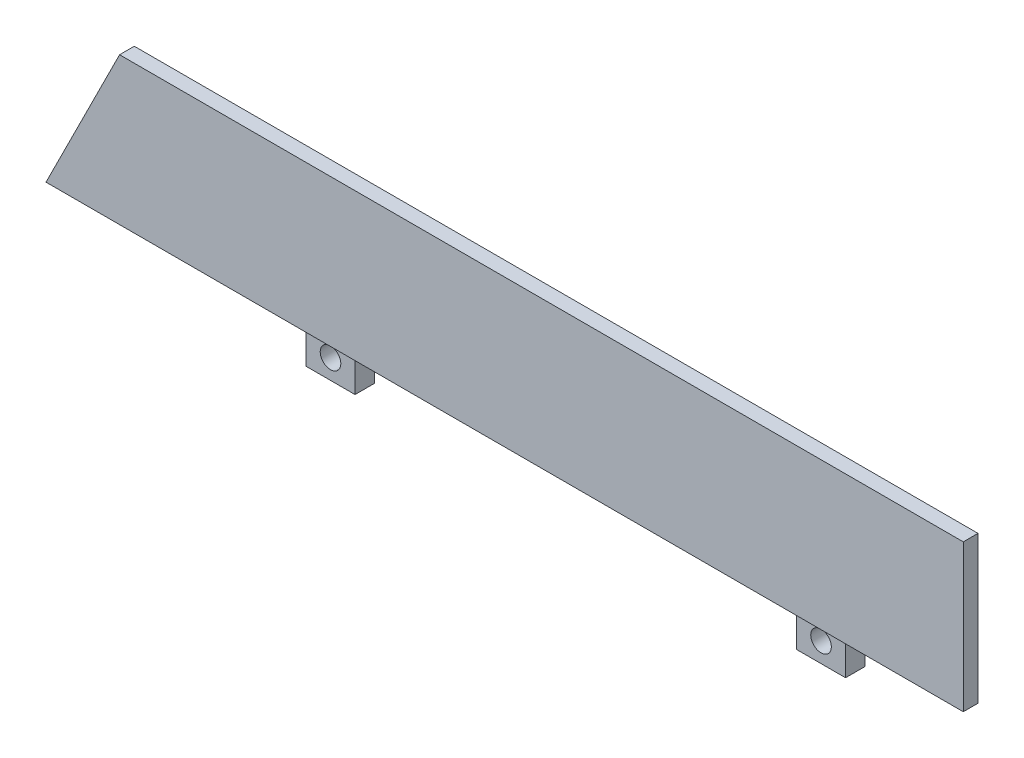
ISO-10303-21;
HEADER;
FILE_DESCRIPTION(('STEP AP214'),'2;1');
FILE_NAME('part.step','',(''),(''),'','','');
FILE_SCHEMA(('AUTOMOTIVE_DESIGN { 1 0 10303 214 1 1 1 1 }'));
ENDSEC;
DATA;
#1=APPLICATION_CONTEXT('core data for automotive mechanical design processes');
#2=APPLICATION_PROTOCOL_DEFINITION('international standard','automotive_design',2000,#1);
#3=PRODUCT_CONTEXT('',#1,'mechanical');
#4=PRODUCT('Part','Part','',(#3));
#5=PRODUCT_RELATED_PRODUCT_CATEGORY('part','',(#4));
#6=PRODUCT_DEFINITION_FORMATION('','',#4);
#7=PRODUCT_DEFINITION_CONTEXT('part definition',#1,'design');
#8=PRODUCT_DEFINITION('design','',#6,#7);
#9=PRODUCT_DEFINITION_SHAPE('','',#8);
#10=(LENGTH_UNIT() NAMED_UNIT(*) SI_UNIT(.MILLI.,.METRE.));
#11=(NAMED_UNIT(*) PLANE_ANGLE_UNIT() SI_UNIT($,.RADIAN.));
#12=(NAMED_UNIT(*) SI_UNIT($,.STERADIAN.) SOLID_ANGLE_UNIT());
#13=UNCERTAINTY_MEASURE_WITH_UNIT(LENGTH_MEASURE(1.E-05),#10,'distance_accuracy_value','');
#14=(GEOMETRIC_REPRESENTATION_CONTEXT(3) GLOBAL_UNCERTAINTY_ASSIGNED_CONTEXT((#13)) GLOBAL_UNIT_ASSIGNED_CONTEXT((#10,
#11,#12)) REPRESENTATION_CONTEXT('',''));
#15=CARTESIAN_POINT('',(0.,0.,0.));
#16=DIRECTION('',(0.,0.,1.));
#17=DIRECTION('',(1.,0.,0.));
#18=AXIS2_PLACEMENT_3D('',#15,#16,#17);
#19=CARTESIAN_POINT('',(0.,0.,0.));
#20=DIRECTION('',(0.,0.,1.));
#21=DIRECTION('',(1.,0.,0.));
#22=AXIS2_PLACEMENT_3D('',#19,#20,#21);
#23=PLANE('',#22);
#24=DIRECTION('',(1.,0.,0.));
#25=VECTOR('',#24,1.);
#26=CARTESIAN_POINT('',(0.,0.,0.));
#27=LINE('',#26,#25);
#28=CARTESIAN_POINT('',(64.,0.,0.));
#29=VERTEX_POINT('',#28);
#30=CARTESIAN_POINT('',(146.,0.,0.));
#31=VERTEX_POINT('',#30);
#32=EDGE_CURVE('E281',#29,#31,#27,.T.);
#33=ORIENTED_EDGE('',*,*,#32,.F.);
#34=DIRECTION('',(0.,1.,0.));
#35=VECTOR('',#34,1.);
#36=CARTESIAN_POINT('',(64.,4.99999999999999,0.));
#37=LINE('',#36,#35);
#38=CARTESIAN_POINT('',(64.,8.99999999999996,0.));
#39=VERTEX_POINT('',#38);
#40=EDGE_CURVE('E337',#29,#39,#37,.T.);
#41=ORIENTED_EDGE('',*,*,#40,.T.);
#42=DIRECTION('',(-1.,0.,0.));
#43=VECTOR('',#42,1.);
#44=CARTESIAN_POINT('',(50.,8.99999999999996,0.));
#45=LINE('',#44,#43);
#46=CARTESIAN_POINT('',(46.,8.99999999999996,0.));
#47=VERTEX_POINT('',#46);
#48=EDGE_CURVE('E334',#39,#47,#45,.T.);
#49=ORIENTED_EDGE('',*,*,#48,.T.);
#50=DIRECTION('',(0.,-1.,0.));
#51=VECTOR('',#50,1.);
#52=CARTESIAN_POINT('',(46.,0.,0.));
#53=LINE('',#52,#51);
#54=CARTESIAN_POINT('',(46.,0.,0.));
#55=VERTEX_POINT('',#54);
#56=EDGE_CURVE('E331',#47,#55,#53,.T.);
#57=ORIENTED_EDGE('',*,*,#56,.T.);
#58=CARTESIAN_POINT('',(0.,0.,0.));
#59=VERTEX_POINT('',#58);
#60=EDGE_CURVE('E276',#59,#55,#27,.T.);
#61=ORIENTED_EDGE('',*,*,#60,.F.);
#62=DIRECTION('',(-0.447213595499959,-0.894427190999916,0.));
#63=VECTOR('',#62,1.);
#64=CARTESIAN_POINT('',(15.,30.,0.));
#65=LINE('',#64,#63);
#66=CARTESIAN_POINT('',(15.,30.,0.));
#67=VERTEX_POINT('',#66);
#68=EDGE_CURVE('E256',#67,#59,#65,.T.);
#69=ORIENTED_EDGE('',*,*,#68,.F.);
#70=DIRECTION('',(-1.,0.,0.));
#71=VECTOR('',#70,1.);
#72=CARTESIAN_POINT('',(187.,30.,0.));
#73=LINE('',#72,#71);
#74=CARTESIAN_POINT('',(187.,30.,0.));
#75=VERTEX_POINT('',#74);
#76=EDGE_CURVE('E262',#75,#67,#73,.T.);
#77=ORIENTED_EDGE('',*,*,#76,.F.);
#78=DIRECTION('',(0.,1.,0.));
#79=VECTOR('',#78,1.);
#80=CARTESIAN_POINT('',(187.,0.,0.));
#81=LINE('',#80,#79);
#82=CARTESIAN_POINT('',(187.,0.,0.));
#83=VERTEX_POINT('',#82);
#84=EDGE_CURVE('E279',#83,#75,#81,.T.);
#85=ORIENTED_EDGE('',*,*,#84,.F.);
#86=CARTESIAN_POINT('',(164.,0.,0.));
#87=VERTEX_POINT('',#86);
#88=EDGE_CURVE('E275',#87,#83,#27,.T.);
#89=ORIENTED_EDGE('',*,*,#88,.F.);
#90=DIRECTION('',(0.,1.,0.));
#91=VECTOR('',#90,1.);
#92=CARTESIAN_POINT('',(164.,5.,0.));
#93=LINE('',#92,#91);
#94=CARTESIAN_POINT('',(164.,8.99999999999998,0.));
#95=VERTEX_POINT('',#94);
#96=EDGE_CURVE('E312',#87,#95,#93,.T.);
#97=ORIENTED_EDGE('',*,*,#96,.T.);
#98=DIRECTION('',(-1.,0.,0.));
#99=VECTOR('',#98,1.);
#100=CARTESIAN_POINT('',(150.,8.99999999999998,0.));
#101=LINE('',#100,#99);
#102=CARTESIAN_POINT('',(146.,8.99999999999998,0.));
#103=VERTEX_POINT('',#102);
#104=EDGE_CURVE('E309',#95,#103,#101,.T.);
#105=ORIENTED_EDGE('',*,*,#104,.T.);
#106=DIRECTION('',(0.,-1.,0.));
#107=VECTOR('',#106,1.);
#108=CARTESIAN_POINT('',(146.,0.,0.));
#109=LINE('',#108,#107);
#110=EDGE_CURVE('E305',#103,#31,#109,.T.);
#111=ORIENTED_EDGE('',*,*,#110,.T.);
#112=EDGE_LOOP('',(#33,#41,#49,#57,#61,#69,#77,#85,#89,#97,#105,#111));
#113=FACE_BOUND('',#112,.T.);
#114=ADVANCED_FACE('F47',(#113),#23,.F.);
#115=CARTESIAN_POINT('',(15.,30.,3.));
#116=DIRECTION('',(0.894427190999916,-0.447213595499958,0.));
#117=DIRECTION('',(0.447213595499959,0.894427190999916,0.));
#118=AXIS2_PLACEMENT_3D('',#115,#116,#117);
#119=PLANE('',#118);
#120=ORIENTED_EDGE('',*,*,#68,.T.);
#121=DIRECTION('',(0.,0.,-1.));
#122=VECTOR('',#121,1.);
#123=CARTESIAN_POINT('',(0.,0.,3.));
#124=LINE('',#123,#122);
#125=CARTESIAN_POINT('',(0.,0.,3.));
#126=VERTEX_POINT('',#125);
#127=EDGE_CURVE('E298',#126,#59,#124,.T.);
#128=ORIENTED_EDGE('',*,*,#127,.F.);
#129=DIRECTION('',(-0.447213595499959,-0.894427190999916,0.));
#130=VECTOR('',#129,1.);
#131=CARTESIAN_POINT('',(15.,30.,3.));
#132=LINE('',#131,#130);
#133=CARTESIAN_POINT('',(15.,30.,3.));
#134=VERTEX_POINT('',#133);
#135=EDGE_CURVE('E257',#134,#126,#132,.T.);
#136=ORIENTED_EDGE('',*,*,#135,.F.);
#137=DIRECTION('',(0.,0.,-1.));
#138=VECTOR('',#137,1.);
#139=CARTESIAN_POINT('',(15.,30.,3.));
#140=LINE('',#139,#138);
#141=EDGE_CURVE('E271',#134,#67,#140,.T.);
#142=ORIENTED_EDGE('',*,*,#141,.T.);
#143=EDGE_LOOP('',(#120,#128,#136,#142));
#144=FACE_BOUND('',#143,.T.);
#145=ADVANCED_FACE('F434',(#144),#119,.F.);
#146=CARTESIAN_POINT('',(0.,0.,3.));
#147=DIRECTION('',(0.,1.,0.));
#148=DIRECTION('',(0.,0.,1.));
#149=AXIS2_PLACEMENT_3D('',#146,#147,#148);
#150=PLANE('',#149);
#151=ORIENTED_EDGE('',*,*,#60,.T.);
#152=DIRECTION('',(-0.707106781186543,0.,0.707106781186552));
#153=VECTOR('',#152,1.);
#154=CARTESIAN_POINT('',(21.5000000000003,0.,24.5));
#155=LINE('',#154,#153);
#156=CARTESIAN_POINT('',(50.,0.,-4.));
#157=VERTEX_POINT('',#156);
#158=EDGE_CURVE('E11',#55,#157,#155,.F.);
#159=ORIENTED_EDGE('',*,*,#158,.T.);
#160=DIRECTION('',(0.,0.,-1.));
#161=VECTOR('',#160,1.);
#162=CARTESIAN_POINT('',(50.,0.,3.));
#163=LINE('',#162,#161);
#164=CARTESIAN_POINT('',(50.,0.,0.));
#165=VERTEX_POINT('',#164);
#166=EDGE_CURVE('E65',#165,#157,#163,.T.);
#167=ORIENTED_EDGE('',*,*,#166,.F.);
#168=CARTESIAN_POINT('',(60.,0.,0.));
#169=VERTEX_POINT('',#168);
#170=EDGE_CURVE('E280',#165,#169,#27,.T.);
#171=ORIENTED_EDGE('',*,*,#170,.T.);
#172=DIRECTION('',(0.,0.,1.));
#173=VECTOR('',#172,1.);
#174=CARTESIAN_POINT('',(60.,0.,3.));
#175=LINE('',#174,#173);
#176=CARTESIAN_POINT('',(60.,0.,-4.));
#177=VERTEX_POINT('',#176);
#178=EDGE_CURVE('E324',#177,#169,#175,.T.);
#179=ORIENTED_EDGE('',*,*,#178,.F.);
#180=DIRECTION('',(-0.707106781186543,0.,-0.707106781186552));
#181=VECTOR('',#180,1.);
#182=CARTESIAN_POINT('',(33.5000000000004,0.,-30.5));
#183=LINE('',#182,#181);
#184=EDGE_CURVE('E58',#177,#29,#183,.F.);
#185=ORIENTED_EDGE('',*,*,#184,.T.);
#186=ORIENTED_EDGE('',*,*,#32,.T.);
#187=DIRECTION('',(-0.707106781186543,0.,0.707106781186552));
#188=VECTOR('',#187,1.);
#189=CARTESIAN_POINT('',(71.500000000001,0.,74.5));
#190=LINE('',#189,#188);
#191=CARTESIAN_POINT('',(150.,0.,-4.));
#192=VERTEX_POINT('',#191);
#193=EDGE_CURVE('E322',#31,#192,#190,.F.);
#194=ORIENTED_EDGE('',*,*,#193,.T.);
#195=DIRECTION('',(0.,0.,-1.));
#196=VECTOR('',#195,1.);
#197=CARTESIAN_POINT('',(150.,0.,3.));
#198=LINE('',#197,#196);
#199=CARTESIAN_POINT('',(150.,0.,0.));
#200=VERTEX_POINT('',#199);
#201=EDGE_CURVE('E315',#200,#192,#198,.T.);
#202=ORIENTED_EDGE('',*,*,#201,.F.);
#203=CARTESIAN_POINT('',(160.,0.,0.));
#204=VERTEX_POINT('',#203);
#205=EDGE_CURVE('E282',#200,#204,#27,.T.);
#206=ORIENTED_EDGE('',*,*,#205,.T.);
#207=DIRECTION('',(0.,0.,1.));
#208=VECTOR('',#207,1.);
#209=CARTESIAN_POINT('',(160.,0.,3.));
#210=LINE('',#209,#208);
#211=CARTESIAN_POINT('',(160.,0.,-4.));
#212=VERTEX_POINT('',#211);
#213=EDGE_CURVE('E302',#212,#204,#210,.T.);
#214=ORIENTED_EDGE('',*,*,#213,.F.);
#215=DIRECTION('',(-0.707106781186543,0.,-0.707106781186552));
#216=VECTOR('',#215,1.);
#217=CARTESIAN_POINT('',(83.5000000000011,0.,-80.5));
#218=LINE('',#217,#216);
#219=EDGE_CURVE('E319',#212,#87,#218,.F.);
#220=ORIENTED_EDGE('',*,*,#219,.T.);
#221=ORIENTED_EDGE('',*,*,#88,.T.);
#222=DIRECTION('',(0.,0.,-1.));
#223=VECTOR('',#222,1.);
#224=CARTESIAN_POINT('',(187.,0.,3.));
#225=LINE('',#224,#223);
#226=CARTESIAN_POINT('',(187.,0.,3.));
#227=VERTEX_POINT('',#226);
#228=EDGE_CURVE('E294',#227,#83,#225,.T.);
#229=ORIENTED_EDGE('',*,*,#228,.F.);
#230=DIRECTION('',(1.,0.,0.));
#231=VECTOR('',#230,1.);
#232=CARTESIAN_POINT('',(0.,0.,3.));
#233=LINE('',#232,#231);
#234=EDGE_CURVE('E261',#126,#227,#233,.T.);
#235=ORIENTED_EDGE('',*,*,#234,.F.);
#236=ORIENTED_EDGE('',*,*,#127,.T.);
#237=EDGE_LOOP('',(#151,#159,#167,#171,#179,#185,#186,#194,#202,#206,#214,#220,#221,#229,#235,#236));
#238=FACE_BOUND('',#237,.T.);
#239=ADVANCED_FACE('F394',(#238),#150,.F.);
#240=CARTESIAN_POINT('',(187.,0.,3.));
#241=DIRECTION('',(-1.,0.,0.));
#242=DIRECTION('',(0.,0.,1.));
#243=AXIS2_PLACEMENT_3D('',#240,#241,#242);
#244=PLANE('',#243);
#245=ORIENTED_EDGE('',*,*,#84,.T.);
#246=DIRECTION('',(0.,0.,-1.));
#247=VECTOR('',#246,1.);
#248=CARTESIAN_POINT('',(187.,30.,3.));
#249=LINE('',#248,#247);
#250=CARTESIAN_POINT('',(187.,30.,3.));
#251=VERTEX_POINT('',#250);
#252=EDGE_CURVE('E290',#251,#75,#249,.T.);
#253=ORIENTED_EDGE('',*,*,#252,.F.);
#254=DIRECTION('',(0.,1.,0.));
#255=VECTOR('',#254,1.);
#256=CARTESIAN_POINT('',(187.,0.,3.));
#257=LINE('',#256,#255);
#258=EDGE_CURVE('E265',#227,#251,#257,.T.);
#259=ORIENTED_EDGE('',*,*,#258,.F.);
#260=ORIENTED_EDGE('',*,*,#228,.T.);
#261=EDGE_LOOP('',(#245,#253,#259,#260));
#262=FACE_BOUND('',#261,.T.);
#263=ADVANCED_FACE('F423',(#262),#244,.F.);
#264=CARTESIAN_POINT('',(187.,30.,3.));
#265=DIRECTION('',(0.,-1.,0.));
#266=DIRECTION('',(1.,0.,0.));
#267=AXIS2_PLACEMENT_3D('',#264,#265,#266);
#268=PLANE('',#267);
#269=ORIENTED_EDGE('',*,*,#76,.T.);
#270=ORIENTED_EDGE('',*,*,#141,.F.);
#271=DIRECTION('',(-1.,0.,0.));
#272=VECTOR('',#271,1.);
#273=CARTESIAN_POINT('',(187.,30.,3.));
#274=LINE('',#273,#272);
#275=EDGE_CURVE('E268',#251,#134,#274,.T.);
#276=ORIENTED_EDGE('',*,*,#275,.F.);
#277=ORIENTED_EDGE('',*,*,#252,.T.);
#278=EDGE_LOOP('',(#269,#270,#276,#277));
#279=FACE_BOUND('',#278,.T.);
#280=ADVANCED_FACE('F427',(#279),#268,.F.);
#281=CARTESIAN_POINT('',(0.,0.,3.));
#282=DIRECTION('',(0.,0.,1.));
#283=DIRECTION('',(1.,0.,0.));
#284=AXIS2_PLACEMENT_3D('',#281,#282,#283);
#285=PLANE('',#284);
#286=ORIENTED_EDGE('',*,*,#135,.T.);
#287=ORIENTED_EDGE('',*,*,#234,.T.);
#288=ORIENTED_EDGE('',*,*,#258,.T.);
#289=ORIENTED_EDGE('',*,*,#275,.T.);
#290=EDGE_LOOP('',(#286,#287,#288,#289));
#291=FACE_BOUND('',#290,.T.);
#292=ADVANCED_FACE('F431',(#291),#285,.T.);
#293=CARTESIAN_POINT('',(0.,0.,-4.));
#294=DIRECTION('',(0.,0.,-1.));
#295=DIRECTION('',(-1.,0.,0.));
#296=AXIS2_PLACEMENT_3D('',#293,#294,#295);
#297=PLANE('',#296);
#298=DIRECTION('',(0.,-1.,0.));
#299=VECTOR('',#298,1.);
#300=CARTESIAN_POINT('',(160.,5.,-4.));
#301=LINE('',#300,#299);
#302=CARTESIAN_POINT('',(160.,5.,-4.));
#303=VERTEX_POINT('',#302);
#304=EDGE_CURVE('E223',#303,#212,#301,.T.);
#305=ORIENTED_EDGE('',*,*,#304,.T.);
#306=CARTESIAN_POINT('',(160.,-9.,-4.));
#307=VERTEX_POINT('',#306);
#308=EDGE_CURVE('E228',#212,#307,#301,.T.);
#309=ORIENTED_EDGE('',*,*,#308,.T.);
#310=DIRECTION('',(-1.,0.,0.));
#311=VECTOR('',#310,1.);
#312=CARTESIAN_POINT('',(160.,-9.,-4.));
#313=LINE('',#312,#311);
#314=CARTESIAN_POINT('',(150.,-9.,-4.));
#315=VERTEX_POINT('',#314);
#316=EDGE_CURVE('E227',#307,#315,#313,.T.);
#317=ORIENTED_EDGE('',*,*,#316,.T.);
#318=DIRECTION('',(0.,1.,0.));
#319=VECTOR('',#318,1.);
#320=CARTESIAN_POINT('',(150.,5.,-4.));
#321=LINE('',#320,#319);
#322=EDGE_CURVE('E232',#315,#192,#321,.T.);
#323=ORIENTED_EDGE('',*,*,#322,.T.);
#324=CARTESIAN_POINT('',(150.,5.,-4.));
#325=VERTEX_POINT('',#324);
#326=EDGE_CURVE('E231',#192,#325,#321,.T.);
#327=ORIENTED_EDGE('',*,*,#326,.T.);
#328=DIRECTION('',(1.,0.,0.));
#329=VECTOR('',#328,1.);
#330=CARTESIAN_POINT('',(160.,5.,-4.));
#331=LINE('',#330,#329);
#332=EDGE_CURVE('E236',#325,#303,#331,.T.);
#333=ORIENTED_EDGE('',*,*,#332,.T.);
#334=EDGE_LOOP('',(#305,#309,#317,#323,#327,#333));
#335=FACE_BOUND('',#334,.T.);
#336=CARTESIAN_POINT('',(155.,-5.,-4.));
#337=DIRECTION('',(0.,0.,-1.));
#338=DIRECTION('',(-1.,0.,0.));
#339=AXIS2_PLACEMENT_3D('',#336,#337,#338);
#340=CIRCLE('',#339,2.09999999999999);
#341=CARTESIAN_POINT('',(152.9,-5.,-4.));
#342=VERTEX_POINT('',#341);
#343=EDGE_CURVE('E214',#342,#342,#340,.T.);
#344=ORIENTED_EDGE('',*,*,#343,.F.);
#345=EDGE_LOOP('',(#344));
#346=FACE_BOUND('',#345,.T.);
#347=ADVANCED_FACE('F408',(#335,#346),#297,.T.);
#348=CARTESIAN_POINT('',(0.,0.,0.));
#349=DIRECTION('',(0.,0.,-1.));
#350=DIRECTION('',(-1.,0.,0.));
#351=AXIS2_PLACEMENT_3D('',#348,#349,#350);
#352=PLANE('',#351);
#353=ORIENTED_EDGE('',*,*,#205,.F.);
#354=DIRECTION('',(0.,1.,0.));
#355=VECTOR('',#354,1.);
#356=CARTESIAN_POINT('',(150.,5.,0.));
#357=LINE('',#356,#355);
#358=CARTESIAN_POINT('',(150.,-9.,0.));
#359=VERTEX_POINT('',#358);
#360=EDGE_CURVE('E245',#359,#200,#357,.T.);
#361=ORIENTED_EDGE('',*,*,#360,.F.);
#362=DIRECTION('',(-1.,0.,0.));
#363=VECTOR('',#362,1.);
#364=CARTESIAN_POINT('',(160.,-9.,0.));
#365=LINE('',#364,#363);
#366=CARTESIAN_POINT('',(160.,-9.,0.));
#367=VERTEX_POINT('',#366);
#368=EDGE_CURVE('E242',#367,#359,#365,.T.);
#369=ORIENTED_EDGE('',*,*,#368,.F.);
#370=DIRECTION('',(0.,-1.,0.));
#371=VECTOR('',#370,1.);
#372=CARTESIAN_POINT('',(160.,5.,0.));
#373=LINE('',#372,#371);
#374=EDGE_CURVE('E218',#204,#367,#373,.T.);
#375=ORIENTED_EDGE('',*,*,#374,.F.);
#376=EDGE_LOOP('',(#353,#361,#369,#375));
#377=FACE_BOUND('',#376,.T.);
#378=CARTESIAN_POINT('',(155.,-5.,0.));
#379=DIRECTION('',(0.,0.,-1.));
#380=DIRECTION('',(-1.,0.,0.));
#381=AXIS2_PLACEMENT_3D('',#378,#379,#380);
#382=CIRCLE('',#381,2.09999999999999);
#383=CARTESIAN_POINT('',(152.9,-5.,0.));
#384=VERTEX_POINT('',#383);
#385=EDGE_CURVE('E219',#384,#384,#382,.T.);
#386=ORIENTED_EDGE('',*,*,#385,.T.);
#387=EDGE_LOOP('',(#386));
#388=FACE_BOUND('',#387,.T.);
#389=ADVANCED_FACE('F399',(#377,#388),#352,.F.);
#390=CARTESIAN_POINT('',(160.,5.,-4.));
#391=DIRECTION('',(-1.,0.,0.));
#392=DIRECTION('',(0.,0.,1.));
#393=AXIS2_PLACEMENT_3D('',#390,#391,#392);
#394=PLANE('',#393);
#395=ORIENTED_EDGE('',*,*,#308,.F.);
#396=ORIENTED_EDGE('',*,*,#213,.T.);
#397=ORIENTED_EDGE('',*,*,#374,.T.);
#398=DIRECTION('',(0.,0.,1.));
#399=VECTOR('',#398,1.);
#400=CARTESIAN_POINT('',(160.,-9.,-4.));
#401=LINE('',#400,#399);
#402=EDGE_CURVE('E252',#307,#367,#401,.T.);
#403=ORIENTED_EDGE('',*,*,#402,.F.);
#404=EDGE_LOOP('',(#395,#396,#397,#403));
#405=FACE_BOUND('',#404,.T.);
#406=ADVANCED_FACE('F403',(#405),#394,.F.);
#407=CARTESIAN_POINT('',(160.,-9.,-4.));
#408=DIRECTION('',(0.,1.,0.));
#409=DIRECTION('',(0.,0.,1.));
#410=AXIS2_PLACEMENT_3D('',#407,#408,#409);
#411=PLANE('',#410);
#412=ORIENTED_EDGE('',*,*,#368,.T.);
#413=DIRECTION('',(0.,0.,1.));
#414=VECTOR('',#413,1.);
#415=CARTESIAN_POINT('',(150.,-9.,-4.));
#416=LINE('',#415,#414);
#417=EDGE_CURVE('E239',#315,#359,#416,.T.);
#418=ORIENTED_EDGE('',*,*,#417,.F.);
#419=ORIENTED_EDGE('',*,*,#316,.F.);
#420=ORIENTED_EDGE('',*,*,#402,.T.);
#421=EDGE_LOOP('',(#412,#418,#419,#420));
#422=FACE_BOUND('',#421,.T.);
#423=ADVANCED_FACE('F452',(#422),#411,.F.);
#424=CARTESIAN_POINT('',(150.,5.,-4.));
#425=DIRECTION('',(1.,0.,0.));
#426=DIRECTION('',(0.,0.,-1.));
#427=AXIS2_PLACEMENT_3D('',#424,#425,#426);
#428=PLANE('',#427);
#429=ORIENTED_EDGE('',*,*,#360,.T.);
#430=ORIENTED_EDGE('',*,*,#201,.T.);
#431=ORIENTED_EDGE('',*,*,#322,.F.);
#432=ORIENTED_EDGE('',*,*,#417,.T.);
#433=EDGE_LOOP('',(#429,#430,#431,#432));
#434=FACE_BOUND('',#433,.T.);
#435=ADVANCED_FACE('F449',(#434),#428,.F.);
#436=CARTESIAN_POINT('',(155.,-5.,-4.));
#437=DIRECTION('',(0.,0.,1.));
#438=DIRECTION('',(1.,0.,0.));
#439=AXIS2_PLACEMENT_3D('',#436,#437,#438);
#440=CYLINDRICAL_SURFACE('',#439,2.09999999999999);
#441=ORIENTED_EDGE('',*,*,#343,.T.);
#442=EDGE_LOOP('',(#441));
#443=FACE_BOUND('',#442,.T.);
#444=ORIENTED_EDGE('',*,*,#385,.F.);
#445=EDGE_LOOP('',(#444));
#446=FACE_BOUND('',#445,.T.);
#447=ADVANCED_FACE('F460',(#443,#446),#440,.F.);
#448=CARTESIAN_POINT('',(150.,5.,-4.00000000000003));
#449=DIRECTION('',(-0.707106781186552,0.,-0.707106781186543));
#450=DIRECTION('',(0.,-1.,0.));
#451=AXIS2_PLACEMENT_3D('',#448,#449,#450);
#452=PLANE('',#451);
#453=ORIENTED_EDGE('',*,*,#193,.F.);
#454=ORIENTED_EDGE('',*,*,#110,.F.);
#455=DIRECTION('',(0.577350269189623,-0.577350269189623,-0.577350269189631));
#456=VECTOR('',#455,1.);
#457=CARTESIAN_POINT('',(150.,5.,-4.00000000000003));
#458=LINE('',#457,#456);
#459=EDGE_CURVE('E208',#325,#103,#458,.F.);
#460=ORIENTED_EDGE('',*,*,#459,.F.);
#461=ORIENTED_EDGE('',*,*,#326,.F.);
#462=EDGE_LOOP('',(#453,#454,#460,#461));
#463=FACE_BOUND('',#462,.T.);
#464=ADVANCED_FACE('F446',(#463),#452,.T.);
#465=CARTESIAN_POINT('',(160.,5.,-4.00000000000003));
#466=DIRECTION('',(0.,0.707106781186552,-0.707106781186543));
#467=DIRECTION('',(-1.,0.,0.));
#468=AXIS2_PLACEMENT_3D('',#465,#466,#467);
#469=PLANE('',#468);
#470=ORIENTED_EDGE('',*,*,#459,.T.);
#471=ORIENTED_EDGE('',*,*,#104,.F.);
#472=DIRECTION('',(-0.577350269189623,-0.577350269189623,-0.577350269189631));
#473=VECTOR('',#472,1.);
#474=CARTESIAN_POINT('',(160.,5.,-4.00000000000003));
#475=LINE('',#474,#473);
#476=EDGE_CURVE('E203',#303,#95,#475,.F.);
#477=ORIENTED_EDGE('',*,*,#476,.F.);
#478=ORIENTED_EDGE('',*,*,#332,.F.);
#479=EDGE_LOOP('',(#470,#471,#477,#478));
#480=FACE_BOUND('',#479,.T.);
#481=ADVANCED_FACE('F484',(#480),#469,.T.);
#482=CARTESIAN_POINT('',(160.,5.,-4.00000000000003));
#483=DIRECTION('',(0.707106781186552,0.,-0.707106781186543));
#484=DIRECTION('',(0.,1.,0.));
#485=AXIS2_PLACEMENT_3D('',#482,#483,#484);
#486=PLANE('',#485);
#487=ORIENTED_EDGE('',*,*,#476,.T.);
#488=ORIENTED_EDGE('',*,*,#96,.F.);
#489=ORIENTED_EDGE('',*,*,#219,.F.);
#490=ORIENTED_EDGE('',*,*,#304,.F.);
#491=EDGE_LOOP('',(#487,#488,#489,#490));
#492=FACE_BOUND('',#491,.T.);
#493=ADVANCED_FACE('F413',(#492),#486,.T.);
#494=CARTESIAN_POINT('',(-100.,0.,0.));
#495=DIRECTION('',(0.,0.,-1.));
#496=DIRECTION('',(-1.,0.,0.));
#497=AXIS2_PLACEMENT_3D('',#494,#495,#496);
#498=PLANE('',#497);
#499=CARTESIAN_POINT('',(55.,-5.00000000000001,0.));
#500=DIRECTION('',(0.,0.,-1.));
#501=DIRECTION('',(-1.,0.,0.));
#502=AXIS2_PLACEMENT_3D('',#499,#500,#501);
#503=CIRCLE('',#502,2.09999999999999);
#504=CARTESIAN_POINT('',(52.9,-5.00000000000001,0.));
#505=VERTEX_POINT('',#504);
#506=EDGE_CURVE('E351',#505,#505,#503,.T.);
#507=ORIENTED_EDGE('',*,*,#506,.T.);
#508=EDGE_LOOP('',(#507));
#509=FACE_BOUND('',#508,.T.);
#510=DIRECTION('',(0.,-1.,0.));
#511=VECTOR('',#510,1.);
#512=CARTESIAN_POINT('',(60.,4.99999999999999,0.));
#513=LINE('',#512,#511);
#514=CARTESIAN_POINT('',(60.,-9.00000000000001,0.));
#515=VERTEX_POINT('',#514);
#516=EDGE_CURVE('E200',#169,#515,#513,.T.);
#517=ORIENTED_EDGE('',*,*,#516,.F.);
#518=ORIENTED_EDGE('',*,*,#170,.F.);
#519=DIRECTION('',(0.,1.,0.));
#520=VECTOR('',#519,1.);
#521=CARTESIAN_POINT('',(50.,4.99999999999999,0.));
#522=LINE('',#521,#520);
#523=CARTESIAN_POINT('',(50.,-9.00000000000001,0.));
#524=VERTEX_POINT('',#523);
#525=EDGE_CURVE('E186',#524,#165,#522,.T.);
#526=ORIENTED_EDGE('',*,*,#525,.F.);
#527=DIRECTION('',(-1.,0.,0.));
#528=VECTOR('',#527,1.);
#529=CARTESIAN_POINT('',(60.,-9.00000000000001,0.));
#530=LINE('',#529,#528);
#531=EDGE_CURVE('E374',#515,#524,#530,.T.);
#532=ORIENTED_EDGE('',*,*,#531,.F.);
#533=EDGE_LOOP('',(#517,#518,#526,#532));
#534=FACE_BOUND('',#533,.T.);
#535=ADVANCED_FACE('F382',(#509,#534),#498,.F.);
#536=CARTESIAN_POINT('',(-100.,0.,-4.));
#537=DIRECTION('',(0.,0.,-1.));
#538=DIRECTION('',(-1.,0.,0.));
#539=AXIS2_PLACEMENT_3D('',#536,#537,#538);
#540=PLANE('',#539);
#541=DIRECTION('',(0.,-1.,0.));
#542=VECTOR('',#541,1.);
#543=CARTESIAN_POINT('',(60.,4.99999999999999,-4.));
#544=LINE('',#543,#542);
#545=CARTESIAN_POINT('',(60.,4.99999999999999,-4.));
#546=VERTEX_POINT('',#545);
#547=EDGE_CURVE('E182',#546,#177,#544,.T.);
#548=ORIENTED_EDGE('',*,*,#547,.T.);
#549=CARTESIAN_POINT('',(60.,-9.00000000000001,-4.));
#550=VERTEX_POINT('',#549);
#551=EDGE_CURVE('E174',#177,#550,#544,.T.);
#552=ORIENTED_EDGE('',*,*,#551,.T.);
#553=DIRECTION('',(-1.,0.,0.));
#554=VECTOR('',#553,1.);
#555=CARTESIAN_POINT('',(60.,-9.00000000000001,-4.));
#556=LINE('',#555,#554);
#557=CARTESIAN_POINT('',(50.,-9.00000000000001,-4.));
#558=VERTEX_POINT('',#557);
#559=EDGE_CURVE('E179',#550,#558,#556,.T.);
#560=ORIENTED_EDGE('',*,*,#559,.T.);
#561=DIRECTION('',(0.,1.,0.));
#562=VECTOR('',#561,1.);
#563=CARTESIAN_POINT('',(50.,4.99999999999999,-4.));
#564=LINE('',#563,#562);
#565=EDGE_CURVE('E367',#558,#157,#564,.T.);
#566=ORIENTED_EDGE('',*,*,#565,.T.);
#567=CARTESIAN_POINT('',(50.,4.99999999999999,-4.));
#568=VERTEX_POINT('',#567);
#569=EDGE_CURVE('E196',#157,#568,#564,.T.);
#570=ORIENTED_EDGE('',*,*,#569,.T.);
#571=DIRECTION('',(1.,0.,0.));
#572=VECTOR('',#571,1.);
#573=CARTESIAN_POINT('',(60.,4.99999999999999,-4.));
#574=LINE('',#573,#572);
#575=EDGE_CURVE('E210',#568,#546,#574,.T.);
#576=ORIENTED_EDGE('',*,*,#575,.T.);
#577=EDGE_LOOP('',(#548,#552,#560,#566,#570,#576));
#578=FACE_BOUND('',#577,.T.);
#579=CARTESIAN_POINT('',(55.,-5.00000000000001,-4.));
#580=DIRECTION('',(0.,0.,-1.));
#581=DIRECTION('',(-1.,0.,0.));
#582=AXIS2_PLACEMENT_3D('',#579,#580,#581);
#583=CIRCLE('',#582,2.09999999999999);
#584=CARTESIAN_POINT('',(52.9,-5.00000000000001,-4.));
#585=VERTEX_POINT('',#584);
#586=EDGE_CURVE('E358',#585,#585,#583,.T.);
#587=ORIENTED_EDGE('',*,*,#586,.F.);
#588=EDGE_LOOP('',(#587));
#589=FACE_BOUND('',#588,.T.);
#590=ADVANCED_FACE('F176',(#578,#589),#540,.T.);
#591=CARTESIAN_POINT('',(60.,4.99999999999999,-4.));
#592=DIRECTION('',(-1.,0.,0.));
#593=DIRECTION('',(0.,0.,1.));
#594=AXIS2_PLACEMENT_3D('',#591,#592,#593);
#595=PLANE('',#594);
#596=ORIENTED_EDGE('',*,*,#551,.F.);
#597=ORIENTED_EDGE('',*,*,#178,.T.);
#598=ORIENTED_EDGE('',*,*,#516,.T.);
#599=DIRECTION('',(0.,0.,1.));
#600=VECTOR('',#599,1.);
#601=CARTESIAN_POINT('',(60.,-9.00000000000001,-4.));
#602=LINE('',#601,#600);
#603=EDGE_CURVE('E191',#550,#515,#602,.T.);
#604=ORIENTED_EDGE('',*,*,#603,.F.);
#605=EDGE_LOOP('',(#596,#597,#598,#604));
#606=FACE_BOUND('',#605,.T.);
#607=ADVANCED_FACE('F198',(#606),#595,.F.);
#608=CARTESIAN_POINT('',(60.,-9.00000000000001,-4.));
#609=DIRECTION('',(0.,1.,0.));
#610=DIRECTION('',(0.,0.,1.));
#611=AXIS2_PLACEMENT_3D('',#608,#609,#610);
#612=PLANE('',#611);
#613=ORIENTED_EDGE('',*,*,#531,.T.);
#614=DIRECTION('',(0.,0.,1.));
#615=VECTOR('',#614,1.);
#616=CARTESIAN_POINT('',(50.,-9.00000000000001,-4.));
#617=LINE('',#616,#615);
#618=EDGE_CURVE('E193',#558,#524,#617,.T.);
#619=ORIENTED_EDGE('',*,*,#618,.F.);
#620=ORIENTED_EDGE('',*,*,#559,.F.);
#621=ORIENTED_EDGE('',*,*,#603,.T.);
#622=EDGE_LOOP('',(#613,#619,#620,#621));
#623=FACE_BOUND('',#622,.T.);
#624=ADVANCED_FACE('F190',(#623),#612,.F.);
#625=CARTESIAN_POINT('',(50.,4.99999999999999,-4.));
#626=DIRECTION('',(1.,0.,0.));
#627=DIRECTION('',(0.,0.,-1.));
#628=AXIS2_PLACEMENT_3D('',#625,#626,#627);
#629=PLANE('',#628);
#630=ORIENTED_EDGE('',*,*,#525,.T.);
#631=ORIENTED_EDGE('',*,*,#166,.T.);
#632=ORIENTED_EDGE('',*,*,#565,.F.);
#633=ORIENTED_EDGE('',*,*,#618,.T.);
#634=EDGE_LOOP('',(#630,#631,#632,#633));
#635=FACE_BOUND('',#634,.T.);
#636=ADVANCED_FACE('F380',(#635),#629,.F.);
#637=CARTESIAN_POINT('',(55.,-5.00000000000001,-4.));
#638=DIRECTION('',(0.,0.,1.));
#639=DIRECTION('',(1.,0.,0.));
#640=AXIS2_PLACEMENT_3D('',#637,#638,#639);
#641=CYLINDRICAL_SURFACE('',#640,2.09999999999999);
#642=ORIENTED_EDGE('',*,*,#586,.T.);
#643=EDGE_LOOP('',(#642));
#644=FACE_BOUND('',#643,.T.);
#645=ORIENTED_EDGE('',*,*,#506,.F.);
#646=EDGE_LOOP('',(#645));
#647=FACE_BOUND('',#646,.T.);
#648=ADVANCED_FACE('F506',(#644,#647),#641,.F.);
#649=CARTESIAN_POINT('',(50.,4.99999999999999,-4.00000000000003));
#650=DIRECTION('',(-0.707106781186552,0.,-0.707106781186543));
#651=DIRECTION('',(0.,-1.,0.));
#652=AXIS2_PLACEMENT_3D('',#649,#650,#651);
#653=PLANE('',#652);
#654=ORIENTED_EDGE('',*,*,#158,.F.);
#655=ORIENTED_EDGE('',*,*,#56,.F.);
#656=DIRECTION('',(0.577350269189623,-0.577350269189623,-0.577350269189631));
#657=VECTOR('',#656,1.);
#658=CARTESIAN_POINT('',(50.,4.99999999999999,-4.00000000000003));
#659=LINE('',#658,#657);
#660=EDGE_CURVE('E52',#568,#47,#659,.F.);
#661=ORIENTED_EDGE('',*,*,#660,.F.);
#662=ORIENTED_EDGE('',*,*,#569,.F.);
#663=EDGE_LOOP('',(#654,#655,#661,#662));
#664=FACE_BOUND('',#663,.T.);
#665=ADVANCED_FACE('F50',(#664),#653,.T.);
#666=CARTESIAN_POINT('',(60.,4.99999999999999,-4.00000000000003));
#667=DIRECTION('',(0.,0.707106781186552,-0.707106781186543));
#668=DIRECTION('',(-1.,0.,0.));
#669=AXIS2_PLACEMENT_3D('',#666,#667,#668);
#670=PLANE('',#669);
#671=ORIENTED_EDGE('',*,*,#660,.T.);
#672=ORIENTED_EDGE('',*,*,#48,.F.);
#673=DIRECTION('',(-0.577350269189623,-0.577350269189623,-0.577350269189631));
#674=VECTOR('',#673,1.);
#675=CARTESIAN_POINT('',(60.,4.99999999999999,-4.00000000000003));
#676=LINE('',#675,#674);
#677=EDGE_CURVE('E343',#546,#39,#676,.F.);
#678=ORIENTED_EDGE('',*,*,#677,.F.);
#679=ORIENTED_EDGE('',*,*,#575,.F.);
#680=EDGE_LOOP('',(#671,#672,#678,#679));
#681=FACE_BOUND('',#680,.T.);
#682=ADVANCED_FACE('F439',(#681),#670,.T.);
#683=CARTESIAN_POINT('',(60.,4.99999999999999,-4.00000000000003));
#684=DIRECTION('',(0.707106781186552,0.,-0.707106781186543));
#685=DIRECTION('',(0.,1.,0.));
#686=AXIS2_PLACEMENT_3D('',#683,#684,#685);
#687=PLANE('',#686);
#688=ORIENTED_EDGE('',*,*,#677,.T.);
#689=ORIENTED_EDGE('',*,*,#40,.F.);
#690=ORIENTED_EDGE('',*,*,#184,.F.);
#691=ORIENTED_EDGE('',*,*,#547,.F.);
#692=EDGE_LOOP('',(#688,#689,#690,#691));
#693=FACE_BOUND('',#692,.T.);
#694=ADVANCED_FACE('F440',(#693),#687,.T.);
#695=CLOSED_SHELL('',(#114,#145,#239,#263,#280,#292,#347,#389,#406,#423,#435,#447,#464,#481,
#493,#535,#590,#607,#624,#636,#648,#665,#682,#694));
#696=MANIFOLD_SOLID_BREP('B2',#695);
#697=ADVANCED_BREP_SHAPE_REPRESENTATION('',(#18,#696),#14);
#698=SHAPE_DEFINITION_REPRESENTATION(#9,#697);
ENDSEC;
END-ISO-10303-21;
